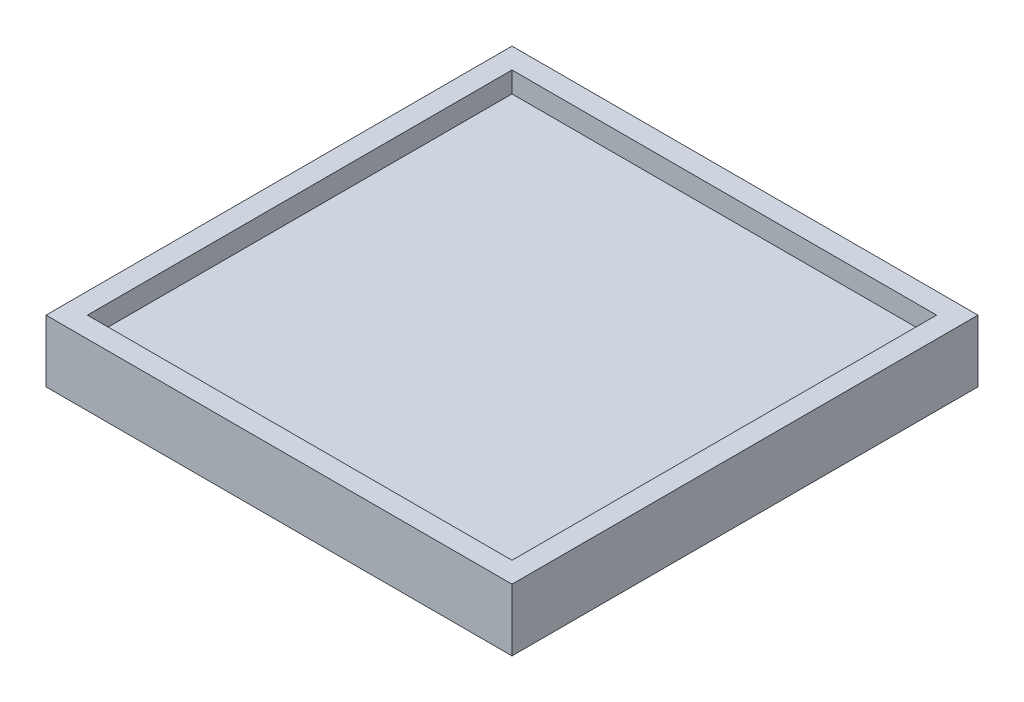
ISO-10303-21;
HEADER;
FILE_DESCRIPTION(('STEP AP214'),'2;1');
FILE_NAME('part.step','',(''),(''),'','','');
FILE_SCHEMA(('AUTOMOTIVE_DESIGN { 1 0 10303 214 1 1 1 1 }'));
ENDSEC;
DATA;
#1=APPLICATION_CONTEXT('core data for automotive mechanical design processes');
#2=APPLICATION_PROTOCOL_DEFINITION('international standard','automotive_design',2000,#1);
#3=PRODUCT_CONTEXT('',#1,'mechanical');
#4=PRODUCT('Part','Part','',(#3));
#5=PRODUCT_RELATED_PRODUCT_CATEGORY('part','',(#4));
#6=PRODUCT_DEFINITION_FORMATION('','',#4);
#7=PRODUCT_DEFINITION_CONTEXT('part definition',#1,'design');
#8=PRODUCT_DEFINITION('design','',#6,#7);
#9=PRODUCT_DEFINITION_SHAPE('','',#8);
#10=(LENGTH_UNIT() NAMED_UNIT(*) SI_UNIT(.MILLI.,.METRE.));
#11=(NAMED_UNIT(*) PLANE_ANGLE_UNIT() SI_UNIT($,.RADIAN.));
#12=(NAMED_UNIT(*) SI_UNIT($,.STERADIAN.) SOLID_ANGLE_UNIT());
#13=UNCERTAINTY_MEASURE_WITH_UNIT(LENGTH_MEASURE(1.E-05),#10,'distance_accuracy_value','');
#14=(GEOMETRIC_REPRESENTATION_CONTEXT(3) GLOBAL_UNCERTAINTY_ASSIGNED_CONTEXT((#13)) GLOBAL_UNIT_ASSIGNED_CONTEXT((#10,
#11,#12)) REPRESENTATION_CONTEXT('',''));
#15=CARTESIAN_POINT('',(0.,0.,0.));
#16=DIRECTION('',(0.,0.,1.));
#17=DIRECTION('',(1.,0.,0.));
#18=AXIS2_PLACEMENT_3D('',#15,#16,#17);
#19=CARTESIAN_POINT('',(0.,30.,-100.));
#20=DIRECTION('',(0.,0.,1.));
#21=DIRECTION('',(1.,0.,0.));
#22=AXIS2_PLACEMENT_3D('',#19,#20,#21);
#23=PLANE('',#22);
#24=DIRECTION('',(-1.,0.,0.));
#25=VECTOR('',#24,1.);
#26=CARTESIAN_POINT('',(0.,0.,-100.));
#27=LINE('',#26,#25);
#28=CARTESIAN_POINT('',(92.,0.,-100.));
#29=VERTEX_POINT('',#28);
#30=CARTESIAN_POINT('',(-133.,0.,-100.));
#31=VERTEX_POINT('',#30);
#32=EDGE_CURVE('E137',#29,#31,#27,.T.);
#33=ORIENTED_EDGE('',*,*,#32,.T.);
#34=DIRECTION('',(0.,-1.,0.));
#35=VECTOR('',#34,1.);
#36=CARTESIAN_POINT('',(-133.,30.,-100.));
#37=LINE('',#36,#35);
#38=CARTESIAN_POINT('',(-133.,30.,-100.));
#39=VERTEX_POINT('',#38);
#40=EDGE_CURVE('E11',#39,#31,#37,.T.);
#41=ORIENTED_EDGE('',*,*,#40,.F.);
#42=DIRECTION('',(-1.,0.,0.));
#43=VECTOR('',#42,1.);
#44=CARTESIAN_POINT('',(0.,30.,-100.));
#45=LINE('',#44,#43);
#46=CARTESIAN_POINT('',(92.,30.,-100.));
#47=VERTEX_POINT('',#46);
#48=EDGE_CURVE('E118',#47,#39,#45,.T.);
#49=ORIENTED_EDGE('',*,*,#48,.F.);
#50=DIRECTION('',(0.,-1.,0.));
#51=VECTOR('',#50,1.);
#52=CARTESIAN_POINT('',(92.,30.,-100.));
#53=LINE('',#52,#51);
#54=EDGE_CURVE('E67',#47,#29,#53,.T.);
#55=ORIENTED_EDGE('',*,*,#54,.T.);
#56=EDGE_LOOP('',(#33,#41,#49,#55));
#57=FACE_BOUND('',#56,.T.);
#58=ADVANCED_FACE('F41',(#57),#23,.F.);
#59=CARTESIAN_POINT('',(-133.,30.,0.));
#60=DIRECTION('',(1.,0.,0.));
#61=DIRECTION('',(0.,0.,-1.));
#62=AXIS2_PLACEMENT_3D('',#59,#60,#61);
#63=PLANE('',#62);
#64=DIRECTION('',(0.,0.,1.));
#65=VECTOR('',#64,1.);
#66=CARTESIAN_POINT('',(-133.,0.,0.));
#67=LINE('',#66,#65);
#68=CARTESIAN_POINT('',(-133.,0.,125.));
#69=VERTEX_POINT('',#68);
#70=EDGE_CURVE('E124',#31,#69,#67,.T.);
#71=ORIENTED_EDGE('',*,*,#70,.T.);
#72=DIRECTION('',(0.,-1.,0.));
#73=VECTOR('',#72,1.);
#74=CARTESIAN_POINT('',(-133.,30.,125.));
#75=LINE('',#74,#73);
#76=CARTESIAN_POINT('',(-133.,30.,125.));
#77=VERTEX_POINT('',#76);
#78=EDGE_CURVE('E50',#77,#69,#75,.T.);
#79=ORIENTED_EDGE('',*,*,#78,.F.);
#80=DIRECTION('',(0.,0.,1.));
#81=VECTOR('',#80,1.);
#82=CARTESIAN_POINT('',(-133.,30.,0.));
#83=LINE('',#82,#81);
#84=EDGE_CURVE('E112',#39,#77,#83,.T.);
#85=ORIENTED_EDGE('',*,*,#84,.F.);
#86=ORIENTED_EDGE('',*,*,#40,.T.);
#87=EDGE_LOOP('',(#71,#79,#85,#86));
#88=FACE_BOUND('',#87,.T.);
#89=ADVANCED_FACE('F123',(#88),#63,.F.);
#90=CARTESIAN_POINT('',(0.,30.,125.));
#91=DIRECTION('',(0.,0.,1.));
#92=DIRECTION('',(1.,0.,0.));
#93=AXIS2_PLACEMENT_3D('',#90,#91,#92);
#94=PLANE('',#93);
#95=DIRECTION('',(-1.,0.,0.));
#96=VECTOR('',#95,1.);
#97=CARTESIAN_POINT('',(0.,0.,125.));
#98=LINE('',#97,#96);
#99=CARTESIAN_POINT('',(92.,0.,125.));
#100=VERTEX_POINT('',#99);
#101=EDGE_CURVE('E141',#100,#69,#98,.T.);
#102=ORIENTED_EDGE('',*,*,#101,.F.);
#103=DIRECTION('',(0.,-1.,0.));
#104=VECTOR('',#103,1.);
#105=CARTESIAN_POINT('',(92.,30.,125.));
#106=LINE('',#105,#104);
#107=CARTESIAN_POINT('',(92.,30.,125.));
#108=VERTEX_POINT('',#107);
#109=EDGE_CURVE('E128',#108,#100,#106,.T.);
#110=ORIENTED_EDGE('',*,*,#109,.F.);
#111=DIRECTION('',(-1.,0.,0.));
#112=VECTOR('',#111,1.);
#113=CARTESIAN_POINT('',(0.,30.,125.));
#114=LINE('',#113,#112);
#115=EDGE_CURVE('E117',#108,#77,#114,.T.);
#116=ORIENTED_EDGE('',*,*,#115,.T.);
#117=ORIENTED_EDGE('',*,*,#78,.T.);
#118=EDGE_LOOP('',(#102,#110,#116,#117));
#119=FACE_BOUND('',#118,.T.);
#120=ADVANCED_FACE('F130',(#119),#94,.T.);
#121=CARTESIAN_POINT('',(-123.,30.,0.));
#122=DIRECTION('',(1.,0.,0.));
#123=DIRECTION('',(0.,0.,-1.));
#124=AXIS2_PLACEMENT_3D('',#121,#122,#123);
#125=PLANE('',#124);
#126=DIRECTION('',(0.,0.,1.));
#127=VECTOR('',#126,1.);
#128=CARTESIAN_POINT('',(-123.,20.,0.));
#129=LINE('',#128,#127);
#130=CARTESIAN_POINT('',(-123.,20.,-90.));
#131=VERTEX_POINT('',#130);
#132=CARTESIAN_POINT('',(-123.,20.,115.));
#133=VERTEX_POINT('',#132);
#134=EDGE_CURVE('E58',#131,#133,#129,.T.);
#135=ORIENTED_EDGE('',*,*,#134,.F.);
#136=DIRECTION('',(0.,-1.,0.));
#137=VECTOR('',#136,1.);
#138=CARTESIAN_POINT('',(-123.,30.,-90.));
#139=LINE('',#138,#137);
#140=CARTESIAN_POINT('',(-123.,30.,-90.));
#141=VERTEX_POINT('',#140);
#142=EDGE_CURVE('E45',#141,#131,#139,.T.);
#143=ORIENTED_EDGE('',*,*,#142,.F.);
#144=DIRECTION('',(0.,0.,1.));
#145=VECTOR('',#144,1.);
#146=CARTESIAN_POINT('',(-123.,30.,0.));
#147=LINE('',#146,#145);
#148=CARTESIAN_POINT('',(-123.,30.,115.));
#149=VERTEX_POINT('',#148);
#150=EDGE_CURVE('E146',#141,#149,#147,.T.);
#151=ORIENTED_EDGE('',*,*,#150,.T.);
#152=DIRECTION('',(0.,-1.,0.));
#153=VECTOR('',#152,1.);
#154=CARTESIAN_POINT('',(-123.,30.,115.));
#155=LINE('',#154,#153);
#156=EDGE_CURVE('E133',#149,#133,#155,.T.);
#157=ORIENTED_EDGE('',*,*,#156,.T.);
#158=EDGE_LOOP('',(#135,#143,#151,#157));
#159=FACE_BOUND('',#158,.T.);
#160=ADVANCED_FACE('F43',(#159),#125,.T.);
#161=CARTESIAN_POINT('',(0.,30.,-90.));
#162=DIRECTION('',(0.,0.,1.));
#163=DIRECTION('',(1.,0.,0.));
#164=AXIS2_PLACEMENT_3D('',#161,#162,#163);
#165=PLANE('',#164);
#166=DIRECTION('',(-1.,0.,0.));
#167=VECTOR('',#166,1.);
#168=CARTESIAN_POINT('',(0.,20.,-90.));
#169=LINE('',#168,#167);
#170=CARTESIAN_POINT('',(82.,20.,-90.));
#171=VERTEX_POINT('',#170);
#172=EDGE_CURVE('E163',#171,#131,#169,.T.);
#173=ORIENTED_EDGE('',*,*,#172,.F.);
#174=DIRECTION('',(0.,-1.,0.));
#175=VECTOR('',#174,1.);
#176=CARTESIAN_POINT('',(82.,30.,-90.));
#177=LINE('',#176,#175);
#178=CARTESIAN_POINT('',(82.,30.,-90.));
#179=VERTEX_POINT('',#178);
#180=EDGE_CURVE('E153',#179,#171,#177,.T.);
#181=ORIENTED_EDGE('',*,*,#180,.F.);
#182=DIRECTION('',(-1.,0.,0.));
#183=VECTOR('',#182,1.);
#184=CARTESIAN_POINT('',(0.,30.,-90.));
#185=LINE('',#184,#183);
#186=EDGE_CURVE('E165',#179,#141,#185,.T.);
#187=ORIENTED_EDGE('',*,*,#186,.T.);
#188=ORIENTED_EDGE('',*,*,#142,.T.);
#189=EDGE_LOOP('',(#173,#181,#187,#188));
#190=FACE_BOUND('',#189,.T.);
#191=ADVANCED_FACE('F162',(#190),#165,.T.);
#192=CARTESIAN_POINT('',(82.,30.,0.));
#193=DIRECTION('',(1.,0.,0.));
#194=DIRECTION('',(0.,0.,-1.));
#195=AXIS2_PLACEMENT_3D('',#192,#193,#194);
#196=PLANE('',#195);
#197=ORIENTED_EDGE('',*,*,#180,.T.);
#198=DIRECTION('',(0.,0.,1.));
#199=VECTOR('',#198,1.);
#200=CARTESIAN_POINT('',(82.,20.,0.));
#201=LINE('',#200,#199);
#202=CARTESIAN_POINT('',(82.,20.,115.));
#203=VERTEX_POINT('',#202);
#204=EDGE_CURVE('E139',#171,#203,#201,.T.);
#205=ORIENTED_EDGE('',*,*,#204,.T.);
#206=DIRECTION('',(0.,-1.,0.));
#207=VECTOR('',#206,1.);
#208=CARTESIAN_POINT('',(82.,30.,115.));
#209=LINE('',#208,#207);
#210=CARTESIAN_POINT('',(82.,30.,115.));
#211=VERTEX_POINT('',#210);
#212=EDGE_CURVE('E151',#211,#203,#209,.T.);
#213=ORIENTED_EDGE('',*,*,#212,.F.);
#214=DIRECTION('',(0.,0.,1.));
#215=VECTOR('',#214,1.);
#216=CARTESIAN_POINT('',(82.,30.,0.));
#217=LINE('',#216,#215);
#218=EDGE_CURVE('E178',#179,#211,#217,.T.);
#219=ORIENTED_EDGE('',*,*,#218,.F.);
#220=EDGE_LOOP('',(#197,#205,#213,#219));
#221=FACE_BOUND('',#220,.T.);
#222=ADVANCED_FACE('F191',(#221),#196,.F.);
#223=CARTESIAN_POINT('',(0.,30.,115.));
#224=DIRECTION('',(0.,0.,1.));
#225=DIRECTION('',(1.,0.,0.));
#226=AXIS2_PLACEMENT_3D('',#223,#224,#225);
#227=PLANE('',#226);
#228=ORIENTED_EDGE('',*,*,#212,.T.);
#229=DIRECTION('',(-1.,0.,0.));
#230=VECTOR('',#229,1.);
#231=CARTESIAN_POINT('',(0.,20.,115.));
#232=LINE('',#231,#230);
#233=EDGE_CURVE('E169',#203,#133,#232,.T.);
#234=ORIENTED_EDGE('',*,*,#233,.T.);
#235=ORIENTED_EDGE('',*,*,#156,.F.);
#236=DIRECTION('',(-1.,0.,0.));
#237=VECTOR('',#236,1.);
#238=CARTESIAN_POINT('',(0.,30.,115.));
#239=LINE('',#238,#237);
#240=EDGE_CURVE('E180',#211,#149,#239,.T.);
#241=ORIENTED_EDGE('',*,*,#240,.F.);
#242=EDGE_LOOP('',(#228,#234,#235,#241));
#243=FACE_BOUND('',#242,.T.);
#244=ADVANCED_FACE('F185',(#243),#227,.F.);
#245=CARTESIAN_POINT('',(92.,30.,0.));
#246=DIRECTION('',(1.,0.,0.));
#247=DIRECTION('',(0.,0.,-1.));
#248=AXIS2_PLACEMENT_3D('',#245,#246,#247);
#249=PLANE('',#248);
#250=DIRECTION('',(0.,0.,1.));
#251=VECTOR('',#250,1.);
#252=CARTESIAN_POINT('',(92.,0.,0.));
#253=LINE('',#252,#251);
#254=EDGE_CURVE('E143',#29,#100,#253,.T.);
#255=ORIENTED_EDGE('',*,*,#254,.F.);
#256=ORIENTED_EDGE('',*,*,#54,.F.);
#257=DIRECTION('',(0.,0.,1.));
#258=VECTOR('',#257,1.);
#259=CARTESIAN_POINT('',(92.,30.,0.));
#260=LINE('',#259,#258);
#261=EDGE_CURVE('E131',#47,#108,#260,.T.);
#262=ORIENTED_EDGE('',*,*,#261,.T.);
#263=ORIENTED_EDGE('',*,*,#109,.T.);
#264=EDGE_LOOP('',(#255,#256,#262,#263));
#265=FACE_BOUND('',#264,.T.);
#266=ADVANCED_FACE('F202',(#265),#249,.T.);
#267=CARTESIAN_POINT('',(0.,30.,0.));
#268=DIRECTION('',(0.,1.,0.));
#269=DIRECTION('',(0.,0.,1.));
#270=AXIS2_PLACEMENT_3D('',#267,#268,#269);
#271=PLANE('',#270);
#272=ORIENTED_EDGE('',*,*,#150,.F.);
#273=ORIENTED_EDGE('',*,*,#186,.F.);
#274=ORIENTED_EDGE('',*,*,#218,.T.);
#275=ORIENTED_EDGE('',*,*,#240,.T.);
#276=EDGE_LOOP('',(#272,#273,#274,#275));
#277=FACE_BOUND('',#276,.T.);
#278=ORIENTED_EDGE('',*,*,#48,.T.);
#279=ORIENTED_EDGE('',*,*,#84,.T.);
#280=ORIENTED_EDGE('',*,*,#115,.F.);
#281=ORIENTED_EDGE('',*,*,#261,.F.);
#282=EDGE_LOOP('',(#278,#279,#280,#281));
#283=FACE_BOUND('',#282,.T.);
#284=ADVANCED_FACE('F114',(#277,#283),#271,.T.);
#285=CARTESIAN_POINT('',(0.,0.,0.));
#286=DIRECTION('',(0.,1.,0.));
#287=DIRECTION('',(0.,0.,1.));
#288=AXIS2_PLACEMENT_3D('',#285,#286,#287);
#289=PLANE('',#288);
#290=ORIENTED_EDGE('',*,*,#32,.F.);
#291=ORIENTED_EDGE('',*,*,#254,.T.);
#292=ORIENTED_EDGE('',*,*,#101,.T.);
#293=ORIENTED_EDGE('',*,*,#70,.F.);
#294=EDGE_LOOP('',(#290,#291,#292,#293));
#295=FACE_BOUND('',#294,.T.);
#296=ADVANCED_FACE('F226',(#295),#289,.F.);
#297=CARTESIAN_POINT('',(0.,20.,0.));
#298=DIRECTION('',(0.,1.,0.));
#299=DIRECTION('',(0.,0.,1.));
#300=AXIS2_PLACEMENT_3D('',#297,#298,#299);
#301=PLANE('',#300);
#302=ORIENTED_EDGE('',*,*,#172,.T.);
#303=ORIENTED_EDGE('',*,*,#134,.T.);
#304=ORIENTED_EDGE('',*,*,#233,.F.);
#305=ORIENTED_EDGE('',*,*,#204,.F.);
#306=EDGE_LOOP('',(#302,#303,#304,#305));
#307=FACE_BOUND('',#306,.T.);
#308=ADVANCED_FACE('F170',(#307),#301,.T.);
#309=CLOSED_SHELL('',(#58,#89,#120,#160,#191,#222,#244,#266,#284,#296,#308));
#310=MANIFOLD_SOLID_BREP('B2',#309);
#311=ADVANCED_BREP_SHAPE_REPRESENTATION('',(#18,#310),#14);
#312=SHAPE_DEFINITION_REPRESENTATION(#9,#311);
ENDSEC;
END-ISO-10303-21;
